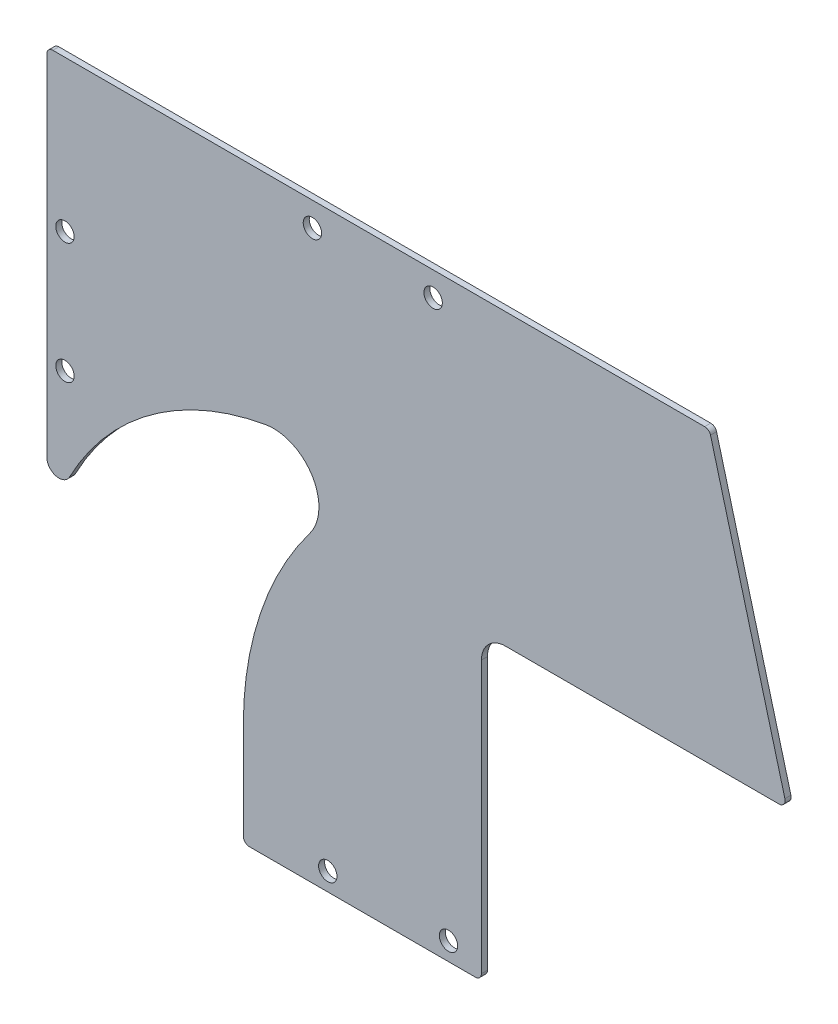
ISO-10303-21;
HEADER;
FILE_DESCRIPTION(('STEP AP214'),'2;1');
FILE_NAME('part.step','',(''),(''),'','','');
FILE_SCHEMA(('AUTOMOTIVE_DESIGN { 1 0 10303 214 1 1 1 1 }'));
ENDSEC;
DATA;
#1=APPLICATION_CONTEXT('core data for automotive mechanical design processes');
#2=APPLICATION_PROTOCOL_DEFINITION('international standard','automotive_design',2000,#1);
#3=PRODUCT_CONTEXT('',#1,'mechanical');
#4=PRODUCT('Part','Part','',(#3));
#5=PRODUCT_RELATED_PRODUCT_CATEGORY('part','',(#4));
#6=PRODUCT_DEFINITION_FORMATION('','',#4);
#7=PRODUCT_DEFINITION_CONTEXT('part definition',#1,'design');
#8=PRODUCT_DEFINITION('design','',#6,#7);
#9=PRODUCT_DEFINITION_SHAPE('','',#8);
#10=(LENGTH_UNIT() NAMED_UNIT(*) SI_UNIT(.MILLI.,.METRE.));
#11=(NAMED_UNIT(*) PLANE_ANGLE_UNIT() SI_UNIT($,.RADIAN.));
#12=(NAMED_UNIT(*) SI_UNIT($,.STERADIAN.) SOLID_ANGLE_UNIT());
#13=UNCERTAINTY_MEASURE_WITH_UNIT(LENGTH_MEASURE(1.E-05),#10,'distance_accuracy_value','');
#14=(GEOMETRIC_REPRESENTATION_CONTEXT(3) GLOBAL_UNCERTAINTY_ASSIGNED_CONTEXT((#13)) GLOBAL_UNIT_ASSIGNED_CONTEXT((#10,
#11,#12)) REPRESENTATION_CONTEXT('',''));
#15=CARTESIAN_POINT('',(0.,0.,0.));
#16=DIRECTION('',(0.,0.,1.));
#17=DIRECTION('',(1.,0.,0.));
#18=AXIS2_PLACEMENT_3D('',#15,#16,#17);
#19=CARTESIAN_POINT('',(-70.,51.5,0.5));
#20=DIRECTION('',(0.,-1.,0.));
#21=DIRECTION('',(0.,0.,-1.));
#22=AXIS2_PLACEMENT_3D('',#19,#20,#21);
#23=PLANE('',#22);
#24=DIRECTION('',(-1.,0.,0.));
#25=VECTOR('',#24,1.);
#26=CARTESIAN_POINT('',(-70.,51.5,0.5));
#27=LINE('',#26,#25);
#28=CARTESIAN_POINT('',(38.9977152093343,51.5,0.5));
#29=VERTEX_POINT('',#28);
#30=CARTESIAN_POINT('',(-69.,51.5,0.5));
#31=VERTEX_POINT('',#30);
#32=EDGE_CURVE('E186',#29,#31,#27,.T.);
#33=ORIENTED_EDGE('',*,*,#32,.F.);
#34=DIRECTION('',(0.,0.,1.));
#35=VECTOR('',#34,1.);
#36=CARTESIAN_POINT('',(38.9977152093343,51.5,0.5));
#37=LINE('',#36,#35);
#38=CARTESIAN_POINT('',(38.9977152093343,51.5,-0.5));
#39=VERTEX_POINT('',#38);
#40=EDGE_CURVE('E258',#29,#39,#37,.F.);
#41=ORIENTED_EDGE('',*,*,#40,.T.);
#42=DIRECTION('',(-1.,0.,0.));
#43=VECTOR('',#42,1.);
#44=CARTESIAN_POINT('',(-70.,51.5,-0.5));
#45=LINE('',#44,#43);
#46=CARTESIAN_POINT('',(-69.,51.5,-0.5));
#47=VERTEX_POINT('',#46);
#48=EDGE_CURVE('E337',#39,#47,#45,.T.);
#49=ORIENTED_EDGE('',*,*,#48,.T.);
#50=DIRECTION('',(0.,0.,-1.));
#51=VECTOR('',#50,1.);
#52=CARTESIAN_POINT('',(-69.,51.5,0.5));
#53=LINE('',#52,#51);
#54=EDGE_CURVE('E59',#47,#31,#53,.F.);
#55=ORIENTED_EDGE('',*,*,#54,.T.);
#56=EDGE_LOOP('',(#33,#41,#49,#55));
#57=FACE_BOUND('',#56,.T.);
#58=ADVANCED_FACE('F36',(#57),#23,.F.);
#59=CARTESIAN_POINT('',(-70.,-51.5,0.5));
#60=DIRECTION('',(1.,0.,0.));
#61=DIRECTION('',(0.,0.,-1.));
#62=AXIS2_PLACEMENT_3D('',#59,#60,#61);
#63=PLANE('',#62);
#64=DIRECTION('',(0.,-1.,0.));
#65=VECTOR('',#64,1.);
#66=CARTESIAN_POINT('',(-70.,-51.5,0.5));
#67=LINE('',#66,#65);
#68=CARTESIAN_POINT('',(-70.,50.5,0.5));
#69=VERTEX_POINT('',#68);
#70=CARTESIAN_POINT('',(-70.,-7.39181994361445,0.5));
#71=VERTEX_POINT('',#70);
#72=EDGE_CURVE('E184',#69,#71,#67,.T.);
#73=ORIENTED_EDGE('',*,*,#72,.F.);
#74=DIRECTION('',(0.,0.,-1.));
#75=VECTOR('',#74,1.);
#76=CARTESIAN_POINT('',(-70.,50.5,0.5));
#77=LINE('',#76,#75);
#78=CARTESIAN_POINT('',(-70.,50.5,-0.5));
#79=VERTEX_POINT('',#78);
#80=EDGE_CURVE('E260',#69,#79,#77,.T.);
#81=ORIENTED_EDGE('',*,*,#80,.T.);
#82=DIRECTION('',(0.,-1.,0.));
#83=VECTOR('',#82,1.);
#84=CARTESIAN_POINT('',(-70.,-51.5,-0.5));
#85=LINE('',#84,#83);
#86=CARTESIAN_POINT('',(-70.,-7.39181994361445,-0.5));
#87=VERTEX_POINT('',#86);
#88=EDGE_CURVE('E189',#79,#87,#85,.T.);
#89=ORIENTED_EDGE('',*,*,#88,.T.);
#90=DIRECTION('',(0.,0.,1.));
#91=VECTOR('',#90,1.);
#92=CARTESIAN_POINT('',(-70.,-7.39181994361445,0.5));
#93=LINE('',#92,#91);
#94=EDGE_CURVE('E206',#87,#71,#93,.T.);
#95=ORIENTED_EDGE('',*,*,#94,.T.);
#96=EDGE_LOOP('',(#73,#81,#89,#95));
#97=FACE_BOUND('',#96,.T.);
#98=ADVANCED_FACE('F341',(#97),#63,.F.);
#99=CARTESIAN_POINT('',(0.,0.,0.5));
#100=DIRECTION('',(0.,0.,-1.));
#101=DIRECTION('',(-1.,0.,0.));
#102=AXIS2_PLACEMENT_3D('',#99,#100,#101);
#103=PLANE('',#102);
#104=CARTESIAN_POINT('',(-3.45000000000001,-43.4999999999971,0.5));
#105=DIRECTION('',(0.,0.,1.));
#106=DIRECTION('',(1.,0.,0.));
#107=AXIS2_PLACEMENT_3D('',#104,#105,#106);
#108=CIRCLE('',#107,1.525);
#109=CARTESIAN_POINT('',(-1.92500000000001,-43.4999999999971,0.5));
#110=VERTEX_POINT('',#109);
#111=EDGE_CURVE('E286',#110,#110,#108,.T.);
#112=ORIENTED_EDGE('',*,*,#111,.F.);
#113=EDGE_LOOP('',(#112));
#114=FACE_BOUND('',#113,.T.);
#115=CARTESIAN_POINT('',(-23.45,-43.4999999999971,0.5));
#116=DIRECTION('',(0.,0.,1.));
#117=DIRECTION('',(1.,0.,0.));
#118=AXIS2_PLACEMENT_3D('',#115,#116,#117);
#119=CIRCLE('',#118,1.525);
#120=CARTESIAN_POINT('',(-21.925,-43.4999999999971,0.5));
#121=VERTEX_POINT('',#120);
#122=EDGE_CURVE('E289',#121,#121,#119,.T.);
#123=ORIENTED_EDGE('',*,*,#122,.F.);
#124=EDGE_LOOP('',(#123));
#125=FACE_BOUND('',#124,.T.);
#126=CARTESIAN_POINT('',(-67.,6.50000000000004,0.5));
#127=DIRECTION('',(0.,0.,-1.));
#128=DIRECTION('',(-1.,0.,0.));
#129=AXIS2_PLACEMENT_3D('',#126,#127,#128);
#130=CIRCLE('',#129,1.525);
#131=CARTESIAN_POINT('',(-68.525,6.50000000000004,0.5));
#132=VERTEX_POINT('',#131);
#133=EDGE_CURVE('E303',#132,#132,#130,.T.);
#134=ORIENTED_EDGE('',*,*,#133,.T.);
#135=EDGE_LOOP('',(#134));
#136=FACE_BOUND('',#135,.T.);
#137=CARTESIAN_POINT('',(-67.,26.5,0.5));
#138=DIRECTION('',(0.,0.,-1.));
#139=DIRECTION('',(-1.,0.,0.));
#140=AXIS2_PLACEMENT_3D('',#137,#138,#139);
#141=CIRCLE('',#140,1.525);
#142=CARTESIAN_POINT('',(-68.525,26.5,0.5));
#143=VERTEX_POINT('',#142);
#144=EDGE_CURVE('E298',#143,#143,#141,.T.);
#145=ORIENTED_EDGE('',*,*,#144,.T.);
#146=EDGE_LOOP('',(#145));
#147=FACE_BOUND('',#146,.T.);
#148=CARTESIAN_POINT('',(-26.,47.4999999999999,0.5));
#149=DIRECTION('',(0.,0.,1.));
#150=DIRECTION('',(1.,0.,0.));
#151=AXIS2_PLACEMENT_3D('',#148,#149,#150);
#152=CIRCLE('',#151,1.525);
#153=CARTESIAN_POINT('',(-24.475,47.4999999999999,0.5));
#154=VERTEX_POINT('',#153);
#155=EDGE_CURVE('E221',#154,#154,#152,.T.);
#156=ORIENTED_EDGE('',*,*,#155,.F.);
#157=EDGE_LOOP('',(#156));
#158=FACE_BOUND('',#157,.T.);
#159=CARTESIAN_POINT('',(-5.99999999999999,47.4999999999999,0.5));
#160=DIRECTION('',(0.,0.,1.));
#161=DIRECTION('',(1.,0.,0.));
#162=AXIS2_PLACEMENT_3D('',#159,#160,#161);
#163=CIRCLE('',#162,1.525);
#164=CARTESIAN_POINT('',(-4.47499999999999,47.4999999999999,0.5));
#165=VERTEX_POINT('',#164);
#166=EDGE_CURVE('E306',#165,#165,#163,.T.);
#167=ORIENTED_EDGE('',*,*,#166,.F.);
#168=EDGE_LOOP('',(#167));
#169=FACE_BOUND('',#168,.T.);
#170=DIRECTION('',(1.,0.,0.));
#171=VECTOR('',#170,1.);
#172=CARTESIAN_POINT('',(0.,3.50000000000301,0.5));
#173=LINE('',#172,#171);
#174=CARTESIAN_POINT('',(5.99999999999893,3.50000000000301,0.5));
#175=VERTEX_POINT('',#174);
#176=CARTESIAN_POINT('',(51.3233780611637,3.50000000000302,0.5));
#177=VERTEX_POINT('',#176);
#178=EDGE_CURVE('E177',#175,#177,#173,.T.);
#179=ORIENTED_EDGE('',*,*,#178,.T.);
#180=CARTESIAN_POINT('',(51.3233780611637,4.50000000000302,0.5));
#181=DIRECTION('',(0.,0.,-1.));
#182=DIRECTION('',(-1.,0.,0.));
#183=AXIS2_PLACEMENT_3D('',#180,#181,#182);
#184=CIRCLE('',#183,1.);
#185=CARTESIAN_POINT('',(52.2893038874528,4.75881904510552,0.5));
#186=VERTEX_POINT('',#185);
#187=EDGE_CURVE('E255',#177,#186,#184,.F.);
#188=ORIENTED_EDGE('',*,*,#187,.T.);
#189=DIRECTION('',(-0.258819045102494,0.965925826289076,0.));
#190=VECTOR('',#189,1.);
#191=CARTESIAN_POINT('',(49.9762894613727,13.3911064018773,0.5));
#192=LINE('',#191,#190);
#193=CARTESIAN_POINT('',(39.9636410356234,50.7588190451025,0.5));
#194=VERTEX_POINT('',#193);
#195=EDGE_CURVE('E178',#186,#194,#192,.T.);
#196=ORIENTED_EDGE('',*,*,#195,.T.);
#197=CARTESIAN_POINT('',(38.9977152093343,50.5,0.5));
#198=DIRECTION('',(0.,0.,-1.));
#199=DIRECTION('',(-1.,0.,0.));
#200=AXIS2_PLACEMENT_3D('',#197,#198,#199);
#201=CIRCLE('',#200,1.);
#202=EDGE_CURVE('E253',#194,#29,#201,.F.);
#203=ORIENTED_EDGE('',*,*,#202,.T.);
#204=ORIENTED_EDGE('',*,*,#32,.T.);
#205=CARTESIAN_POINT('',(-69.,50.5,0.5));
#206=DIRECTION('',(0.,0.,-1.));
#207=DIRECTION('',(-1.,0.,0.));
#208=AXIS2_PLACEMENT_3D('',#205,#206,#207);
#209=CIRCLE('',#208,1.);
#210=EDGE_CURVE('E51',#31,#69,#209,.F.);
#211=ORIENTED_EDGE('',*,*,#210,.T.);
#212=ORIENTED_EDGE('',*,*,#72,.T.);
#213=CARTESIAN_POINT('',(-68.,-7.39181994361445,0.5));
#214=DIRECTION('',(0.,0.,-1.));
#215=DIRECTION('',(-1.,0.,0.));
#216=AXIS2_PLACEMENT_3D('',#213,#214,#215);
#217=CIRCLE('',#216,2.);
#218=CARTESIAN_POINT('',(-66.2287922778268,-8.32070271604262,0.5));
#219=VERTEX_POINT('',#218);
#220=EDGE_CURVE('E209',#71,#219,#217,.F.);
#221=ORIENTED_EDGE('',*,*,#220,.T.);
#222=CARTESIAN_POINT('',(-25.8437878262082,-29.499999999997,0.5));
#223=DIRECTION('',(0.,0.,-1.));
#224=DIRECTION('',(-1.,0.,0.));
#225=AXIS2_PLACEMENT_3D('',#222,#223,#224);
#226=CIRCLE('',#225,45.6016580619539);
#227=CARTESIAN_POINT('',(-33.7501159785722,15.4110364292205,0.5));
#228=VERTEX_POINT('',#227);
#229=EDGE_CURVE('E335',#219,#228,#226,.T.);
#230=ORIENTED_EDGE('',*,*,#229,.T.);
#231=CARTESIAN_POINT('',(-32.4454458881621,8.00000000000298,0.5));
#232=DIRECTION('',(0.,0.,-1.));
#233=DIRECTION('',(-1.,0.,0.));
#234=AXIS2_PLACEMENT_3D('',#231,#232,#233);
#235=CIRCLE('',#234,7.52500000000001);
#236=CARTESIAN_POINT('',(-26.4308671354947,3.47778069661205,0.5));
#237=VERTEX_POINT('',#236);
#238=EDGE_CURVE('E332',#228,#237,#235,.T.);
#239=ORIENTED_EDGE('',*,*,#238,.T.);
#240=CARTESIAN_POINT('',(17.4297786627361,-29.499999999997,0.5));
#241=DIRECTION('',(0.,0.,-1.));
#242=DIRECTION('',(-1.,0.,0.));
#243=AXIS2_PLACEMENT_3D('',#240,#241,#242);
#244=CIRCLE('',#243,54.8752245508982);
#245=CARTESIAN_POINT('',(-37.4454458881621,-29.499999999997,0.5));
#246=VERTEX_POINT('',#245);
#247=EDGE_CURVE('E329',#237,#246,#244,.F.);
#248=ORIENTED_EDGE('',*,*,#247,.T.);
#249=DIRECTION('',(0.,-1.,0.));
#250=VECTOR('',#249,1.);
#251=CARTESIAN_POINT('',(-37.4454458881621,0.,0.5));
#252=LINE('',#251,#250);
#253=CARTESIAN_POINT('',(-37.4454458881621,-45.4999999999971,0.5));
#254=VERTEX_POINT('',#253);
#255=EDGE_CURVE('E327',#246,#254,#252,.T.);
#256=ORIENTED_EDGE('',*,*,#255,.T.);
#257=CARTESIAN_POINT('',(-36.4454458881621,-45.4999999999971,0.5));
#258=DIRECTION('',(0.,0.,-1.));
#259=DIRECTION('',(-1.,0.,0.));
#260=AXIS2_PLACEMENT_3D('',#257,#258,#259);
#261=CIRCLE('',#260,1.);
#262=CARTESIAN_POINT('',(-36.4454458881621,-46.4999999999971,0.5));
#263=VERTEX_POINT('',#262);
#264=EDGE_CURVE('E248',#254,#263,#261,.F.);
#265=ORIENTED_EDGE('',*,*,#264,.T.);
#266=DIRECTION('',(-1.,0.,0.));
#267=VECTOR('',#266,1.);
#268=CARTESIAN_POINT('',(-37.4454458881621,-46.4999999999971,0.5));
#269=LINE('',#268,#267);
#270=CARTESIAN_POINT('',(0.999999999998932,-46.4999999999971,0.5));
#271=VERTEX_POINT('',#270);
#272=EDGE_CURVE('E282',#271,#263,#269,.T.);
#273=ORIENTED_EDGE('',*,*,#272,.F.);
#274=CARTESIAN_POINT('',(0.999999999998932,-45.4999999999971,0.5));
#275=DIRECTION('',(0.,0.,-1.));
#276=DIRECTION('',(-1.,0.,0.));
#277=AXIS2_PLACEMENT_3D('',#274,#275,#276);
#278=CIRCLE('',#277,1.);
#279=CARTESIAN_POINT('',(1.99999999999893,-45.4999999999971,0.5));
#280=VERTEX_POINT('',#279);
#281=EDGE_CURVE('E250',#271,#280,#278,.F.);
#282=ORIENTED_EDGE('',*,*,#281,.T.);
#283=DIRECTION('',(0.,1.,0.));
#284=VECTOR('',#283,1.);
#285=CARTESIAN_POINT('',(1.99999999999893,0.,0.5));
#286=LINE('',#285,#284);
#287=CARTESIAN_POINT('',(1.99999999999893,-0.499999999996981,0.5));
#288=VERTEX_POINT('',#287);
#289=EDGE_CURVE('E271',#280,#288,#286,.T.);
#290=ORIENTED_EDGE('',*,*,#289,.T.);
#291=CARTESIAN_POINT('',(5.99999999999893,-0.499999999996982,0.5));
#292=DIRECTION('',(0.,0.,-1.));
#293=DIRECTION('',(-1.,0.,0.));
#294=AXIS2_PLACEMENT_3D('',#291,#292,#293);
#295=CIRCLE('',#294,4.);
#296=EDGE_CURVE('E324',#288,#175,#295,.T.);
#297=ORIENTED_EDGE('',*,*,#296,.T.);
#298=EDGE_LOOP('',(#179,#188,#196,#203,#204,#211,#212,#221,#230,#239,#248,#256,#265,#273,#282,
#290,#297));
#299=FACE_BOUND('',#298,.T.);
#300=ADVANCED_FACE('F284',(#114,#125,#136,#147,#158,#169,#299),#103,.F.);
#301=CARTESIAN_POINT('',(0.,0.,-0.5));
#302=DIRECTION('',(0.,0.,-1.));
#303=DIRECTION('',(-1.,0.,0.));
#304=AXIS2_PLACEMENT_3D('',#301,#302,#303);
#305=PLANE('',#304);
#306=DIRECTION('',(-0.258819045102494,0.965925826289076,0.));
#307=VECTOR('',#306,1.);
#308=CARTESIAN_POINT('',(49.9762894613727,13.3911064018773,-0.5));
#309=LINE('',#308,#307);
#310=CARTESIAN_POINT('',(52.2893038874528,4.75881904510552,-0.5));
#311=VERTEX_POINT('',#310);
#312=CARTESIAN_POINT('',(39.9636410356234,50.7588190451025,-0.5));
#313=VERTEX_POINT('',#312);
#314=EDGE_CURVE('E203',#311,#313,#309,.T.);
#315=ORIENTED_EDGE('',*,*,#314,.F.);
#316=CARTESIAN_POINT('',(51.3233780611637,4.50000000000302,-0.5));
#317=DIRECTION('',(0.,0.,-1.));
#318=DIRECTION('',(-1.,0.,0.));
#319=AXIS2_PLACEMENT_3D('',#316,#317,#318);
#320=CIRCLE('',#319,1.);
#321=CARTESIAN_POINT('',(51.3233780611637,3.50000000000302,-0.5));
#322=VERTEX_POINT('',#321);
#323=EDGE_CURVE('E183',#311,#322,#320,.T.);
#324=ORIENTED_EDGE('',*,*,#323,.T.);
#325=DIRECTION('',(1.,0.,0.));
#326=VECTOR('',#325,1.);
#327=CARTESIAN_POINT('',(0.,3.50000000000301,-0.5));
#328=LINE('',#327,#326);
#329=CARTESIAN_POINT('',(5.99999999999893,3.50000000000301,-0.5));
#330=VERTEX_POINT('',#329);
#331=EDGE_CURVE('E170',#330,#322,#328,.T.);
#332=ORIENTED_EDGE('',*,*,#331,.F.);
#333=CARTESIAN_POINT('',(5.99999999999893,-0.499999999996982,-0.5));
#334=DIRECTION('',(0.,0.,-1.));
#335=DIRECTION('',(-1.,0.,0.));
#336=AXIS2_PLACEMENT_3D('',#333,#334,#335);
#337=CIRCLE('',#336,4.);
#338=CARTESIAN_POINT('',(1.99999999999893,-0.499999999996981,-0.5));
#339=VERTEX_POINT('',#338);
#340=EDGE_CURVE('E158',#339,#330,#337,.T.);
#341=ORIENTED_EDGE('',*,*,#340,.F.);
#342=DIRECTION('',(0.,1.,0.));
#343=VECTOR('',#342,1.);
#344=CARTESIAN_POINT('',(1.99999999999893,0.,-0.5));
#345=LINE('',#344,#343);
#346=CARTESIAN_POINT('',(1.99999999999893,-45.4999999999971,-0.5));
#347=VERTEX_POINT('',#346);
#348=EDGE_CURVE('E169',#347,#339,#345,.T.);
#349=ORIENTED_EDGE('',*,*,#348,.F.);
#350=CARTESIAN_POINT('',(0.999999999998932,-45.4999999999971,-0.5));
#351=DIRECTION('',(0.,0.,-1.));
#352=DIRECTION('',(-1.,0.,0.));
#353=AXIS2_PLACEMENT_3D('',#350,#351,#352);
#354=CIRCLE('',#353,1.);
#355=CARTESIAN_POINT('',(0.999999999998932,-46.4999999999971,-0.5));
#356=VERTEX_POINT('',#355);
#357=EDGE_CURVE('E239',#347,#356,#354,.T.);
#358=ORIENTED_EDGE('',*,*,#357,.T.);
#359=DIRECTION('',(1.,0.,0.));
#360=VECTOR('',#359,1.);
#361=CARTESIAN_POINT('',(0.,-46.4999999999971,-0.5));
#362=LINE('',#361,#360);
#363=CARTESIAN_POINT('',(-36.4454458881621,-46.4999999999971,-0.5));
#364=VERTEX_POINT('',#363);
#365=EDGE_CURVE('E228',#364,#356,#362,.T.);
#366=ORIENTED_EDGE('',*,*,#365,.F.);
#367=CARTESIAN_POINT('',(-36.4454458881621,-45.4999999999971,-0.5));
#368=DIRECTION('',(0.,0.,-1.));
#369=DIRECTION('',(-1.,0.,0.));
#370=AXIS2_PLACEMENT_3D('',#367,#368,#369);
#371=CIRCLE('',#370,1.);
#372=CARTESIAN_POINT('',(-37.4454458881621,-45.4999999999971,-0.5));
#373=VERTEX_POINT('',#372);
#374=EDGE_CURVE('E237',#364,#373,#371,.T.);
#375=ORIENTED_EDGE('',*,*,#374,.T.);
#376=DIRECTION('',(0.,-1.,0.));
#377=VECTOR('',#376,1.);
#378=CARTESIAN_POINT('',(-37.4454458881621,0.,-0.5));
#379=LINE('',#378,#377);
#380=CARTESIAN_POINT('',(-37.4454458881621,-29.499999999997,-0.5));
#381=VERTEX_POINT('',#380);
#382=EDGE_CURVE('E193',#381,#373,#379,.T.);
#383=ORIENTED_EDGE('',*,*,#382,.F.);
#384=CARTESIAN_POINT('',(17.4297786627361,-29.499999999997,-0.5));
#385=DIRECTION('',(0.,0.,-1.));
#386=DIRECTION('',(-1.,0.,0.));
#387=AXIS2_PLACEMENT_3D('',#384,#385,#386);
#388=CIRCLE('',#387,54.8752245508982);
#389=CARTESIAN_POINT('',(-26.4308671354947,3.47778069661205,-0.5));
#390=VERTEX_POINT('',#389);
#391=EDGE_CURVE('E196',#390,#381,#388,.F.);
#392=ORIENTED_EDGE('',*,*,#391,.F.);
#393=CARTESIAN_POINT('',(-32.4454458881621,8.00000000000298,-0.5));
#394=DIRECTION('',(0.,0.,-1.));
#395=DIRECTION('',(-1.,0.,0.));
#396=AXIS2_PLACEMENT_3D('',#393,#394,#395);
#397=CIRCLE('',#396,7.52500000000001);
#398=CARTESIAN_POINT('',(-33.7501159785722,15.4110364292205,-0.5));
#399=VERTEX_POINT('',#398);
#400=EDGE_CURVE('E199',#399,#390,#397,.T.);
#401=ORIENTED_EDGE('',*,*,#400,.F.);
#402=CARTESIAN_POINT('',(-25.8437878262082,-29.499999999997,-0.5));
#403=DIRECTION('',(0.,0.,-1.));
#404=DIRECTION('',(-1.,0.,0.));
#405=AXIS2_PLACEMENT_3D('',#402,#403,#404);
#406=CIRCLE('',#405,45.6016580619539);
#407=CARTESIAN_POINT('',(-66.2287922778268,-8.32070271604262,-0.5));
#408=VERTEX_POINT('',#407);
#409=EDGE_CURVE('E201',#408,#399,#406,.T.);
#410=ORIENTED_EDGE('',*,*,#409,.F.);
#411=CARTESIAN_POINT('',(-68.,-7.39181994361445,-0.5));
#412=DIRECTION('',(0.,0.,-1.));
#413=DIRECTION('',(-1.,0.,0.));
#414=AXIS2_PLACEMENT_3D('',#411,#412,#413);
#415=CIRCLE('',#414,2.);
#416=EDGE_CURVE('E213',#408,#87,#415,.T.);
#417=ORIENTED_EDGE('',*,*,#416,.T.);
#418=ORIENTED_EDGE('',*,*,#88,.F.);
#419=CARTESIAN_POINT('',(-69.,50.5,-0.5));
#420=DIRECTION('',(0.,0.,-1.));
#421=DIRECTION('',(-1.,0.,0.));
#422=AXIS2_PLACEMENT_3D('',#419,#420,#421);
#423=CIRCLE('',#422,1.);
#424=EDGE_CURVE('E241',#79,#47,#423,.T.);
#425=ORIENTED_EDGE('',*,*,#424,.T.);
#426=ORIENTED_EDGE('',*,*,#48,.F.);
#427=CARTESIAN_POINT('',(38.9977152093343,50.5,-0.5));
#428=DIRECTION('',(0.,0.,-1.));
#429=DIRECTION('',(-1.,0.,0.));
#430=AXIS2_PLACEMENT_3D('',#427,#428,#429);
#431=CIRCLE('',#430,1.);
#432=EDGE_CURVE('E243',#39,#313,#431,.T.);
#433=ORIENTED_EDGE('',*,*,#432,.T.);
#434=EDGE_LOOP('',(#315,#324,#332,#341,#349,#358,#366,#375,#383,#392,#401,#410,#417,#418,#425,
#426,#433));
#435=FACE_BOUND('',#434,.T.);
#436=CARTESIAN_POINT('',(-3.45000000000001,-43.4999999999971,-0.5));
#437=DIRECTION('',(0.,0.,-1.));
#438=DIRECTION('',(-1.,0.,0.));
#439=AXIS2_PLACEMENT_3D('',#436,#437,#438);
#440=CIRCLE('',#439,1.525);
#441=CARTESIAN_POINT('',(-4.97500000000001,-43.4999999999971,-0.5));
#442=VERTEX_POINT('',#441);
#443=EDGE_CURVE('E227',#442,#442,#440,.T.);
#444=ORIENTED_EDGE('',*,*,#443,.F.);
#445=EDGE_LOOP('',(#444));
#446=FACE_BOUND('',#445,.T.);
#447=CARTESIAN_POINT('',(-23.45,-43.4999999999971,-0.5));
#448=DIRECTION('',(0.,0.,-1.));
#449=DIRECTION('',(-1.,0.,0.));
#450=AXIS2_PLACEMENT_3D('',#447,#448,#449);
#451=CIRCLE('',#450,1.525);
#452=CARTESIAN_POINT('',(-24.975,-43.4999999999971,-0.5));
#453=VERTEX_POINT('',#452);
#454=EDGE_CURVE('E224',#453,#453,#451,.T.);
#455=ORIENTED_EDGE('',*,*,#454,.F.);
#456=EDGE_LOOP('',(#455));
#457=FACE_BOUND('',#456,.T.);
#458=CARTESIAN_POINT('',(-67.,6.50000000000004,-0.5));
#459=DIRECTION('',(0.,0.,-1.));
#460=DIRECTION('',(-1.,0.,0.));
#461=AXIS2_PLACEMENT_3D('',#458,#459,#460);
#462=CIRCLE('',#461,1.525);
#463=CARTESIAN_POINT('',(-68.525,6.50000000000004,-0.5));
#464=VERTEX_POINT('',#463);
#465=EDGE_CURVE('E295',#464,#464,#462,.T.);
#466=ORIENTED_EDGE('',*,*,#465,.F.);
#467=EDGE_LOOP('',(#466));
#468=FACE_BOUND('',#467,.T.);
#469=CARTESIAN_POINT('',(-67.,26.5,-0.5));
#470=DIRECTION('',(0.,0.,-1.));
#471=DIRECTION('',(-1.,0.,0.));
#472=AXIS2_PLACEMENT_3D('',#469,#470,#471);
#473=CIRCLE('',#472,1.525);
#474=CARTESIAN_POINT('',(-68.525,26.5,-0.5));
#475=VERTEX_POINT('',#474);
#476=EDGE_CURVE('E231',#475,#475,#473,.T.);
#477=ORIENTED_EDGE('',*,*,#476,.F.);
#478=EDGE_LOOP('',(#477));
#479=FACE_BOUND('',#478,.T.);
#480=CARTESIAN_POINT('',(-26.,47.4999999999999,-0.5));
#481=DIRECTION('',(0.,0.,-1.));
#482=DIRECTION('',(-1.,0.,0.));
#483=AXIS2_PLACEMENT_3D('',#480,#481,#482);
#484=CIRCLE('',#483,1.525);
#485=CARTESIAN_POINT('',(-27.525,47.4999999999999,-0.5));
#486=VERTEX_POINT('',#485);
#487=EDGE_CURVE('E220',#486,#486,#484,.T.);
#488=ORIENTED_EDGE('',*,*,#487,.F.);
#489=EDGE_LOOP('',(#488));
#490=FACE_BOUND('',#489,.T.);
#491=CARTESIAN_POINT('',(-5.99999999999999,47.4999999999999,-0.5));
#492=DIRECTION('',(0.,0.,-1.));
#493=DIRECTION('',(-1.,0.,0.));
#494=AXIS2_PLACEMENT_3D('',#491,#492,#493);
#495=CIRCLE('',#494,1.525);
#496=CARTESIAN_POINT('',(-7.52499999999999,47.4999999999999,-0.5));
#497=VERTEX_POINT('',#496);
#498=EDGE_CURVE('E217',#497,#497,#495,.T.);
#499=ORIENTED_EDGE('',*,*,#498,.F.);
#500=EDGE_LOOP('',(#499));
#501=FACE_BOUND('',#500,.T.);
#502=ADVANCED_FACE('F181',(#435,#446,#457,#468,#479,#490,#501),#305,.T.);
#503=CARTESIAN_POINT('',(1.99999999999893,-0.499999999996982,-1.));
#504=DIRECTION('',(-1.,0.,0.));
#505=DIRECTION('',(0.,-1.,0.));
#506=AXIS2_PLACEMENT_3D('',#503,#504,#505);
#507=PLANE('',#506);
#508=ORIENTED_EDGE('',*,*,#289,.F.);
#509=DIRECTION('',(0.,0.,1.));
#510=VECTOR('',#509,1.);
#511=CARTESIAN_POINT('',(1.99999999999893,-45.4999999999971,-1.));
#512=LINE('',#511,#510);
#513=EDGE_CURVE('E44',#280,#347,#512,.F.);
#514=ORIENTED_EDGE('',*,*,#513,.T.);
#515=ORIENTED_EDGE('',*,*,#348,.T.);
#516=DIRECTION('',(0.,0.,1.));
#517=VECTOR('',#516,1.);
#518=CARTESIAN_POINT('',(1.99999999999893,-0.499999999996981,-1.));
#519=LINE('',#518,#517);
#520=EDGE_CURVE('E165',#339,#288,#519,.T.);
#521=ORIENTED_EDGE('',*,*,#520,.T.);
#522=EDGE_LOOP('',(#508,#514,#515,#521));
#523=FACE_BOUND('',#522,.T.);
#524=ADVANCED_FACE('F270',(#523),#507,.F.);
#525=CARTESIAN_POINT('',(5.99999999999893,-0.499999999996982,-1.));
#526=DIRECTION('',(0.,0.,1.));
#527=DIRECTION('',(1.,0.,0.));
#528=AXIS2_PLACEMENT_3D('',#525,#526,#527);
#529=CYLINDRICAL_SURFACE('',#528,4.);
#530=ORIENTED_EDGE('',*,*,#520,.F.);
#531=ORIENTED_EDGE('',*,*,#340,.T.);
#532=DIRECTION('',(0.,0.,1.));
#533=VECTOR('',#532,1.);
#534=CARTESIAN_POINT('',(5.99999999999893,3.50000000000301,-1.));
#535=LINE('',#534,#533);
#536=EDGE_CURVE('E162',#330,#175,#535,.T.);
#537=ORIENTED_EDGE('',*,*,#536,.T.);
#538=ORIENTED_EDGE('',*,*,#296,.F.);
#539=EDGE_LOOP('',(#530,#531,#537,#538));
#540=FACE_BOUND('',#539,.T.);
#541=ADVANCED_FACE('F160',(#540),#529,.F.);
#542=CARTESIAN_POINT('',(33.9999999999989,3.50000000000302,-1.));
#543=DIRECTION('',(0.,1.,0.));
#544=DIRECTION('',(-1.,0.,0.));
#545=AXIS2_PLACEMENT_3D('',#542,#543,#544);
#546=PLANE('',#545);
#547=ORIENTED_EDGE('',*,*,#331,.T.);
#548=DIRECTION('',(0.,0.,-1.));
#549=VECTOR('',#548,1.);
#550=CARTESIAN_POINT('',(51.3233780611637,3.50000000000302,-1.));
#551=LINE('',#550,#549);
#552=EDGE_CURVE('E246',#322,#177,#551,.F.);
#553=ORIENTED_EDGE('',*,*,#552,.T.);
#554=ORIENTED_EDGE('',*,*,#178,.F.);
#555=ORIENTED_EDGE('',*,*,#536,.F.);
#556=EDGE_LOOP('',(#547,#553,#554,#555));
#557=FACE_BOUND('',#556,.T.);
#558=ADVANCED_FACE('F174',(#557),#546,.F.);
#559=CARTESIAN_POINT('',(-25.8437878262082,-29.499999999997,-1.));
#560=DIRECTION('',(0.,0.,1.));
#561=DIRECTION('',(1.,0.,0.));
#562=AXIS2_PLACEMENT_3D('',#559,#560,#561);
#563=CYLINDRICAL_SURFACE('',#562,45.6016580619539);
#564=ORIENTED_EDGE('',*,*,#229,.F.);
#565=DIRECTION('',(0.,0.,1.));
#566=VECTOR('',#565,1.);
#567=CARTESIAN_POINT('',(-66.2287922778268,-8.32070271604262,-1.));
#568=LINE('',#567,#566);
#569=EDGE_CURVE('E211',#219,#408,#568,.F.);
#570=ORIENTED_EDGE('',*,*,#569,.T.);
#571=ORIENTED_EDGE('',*,*,#409,.T.);
#572=DIRECTION('',(0.,0.,1.));
#573=VECTOR('',#572,1.);
#574=CARTESIAN_POINT('',(-33.7501159785722,15.4110364292205,-1.));
#575=LINE('',#574,#573);
#576=EDGE_CURVE('E313',#399,#228,#575,.T.);
#577=ORIENTED_EDGE('',*,*,#576,.T.);
#578=EDGE_LOOP('',(#564,#570,#571,#577));
#579=FACE_BOUND('',#578,.T.);
#580=ADVANCED_FACE('F354',(#579),#563,.F.);
#581=CARTESIAN_POINT('',(-32.4454458881621,8.00000000000298,-1.));
#582=DIRECTION('',(0.,0.,1.));
#583=DIRECTION('',(1.,0.,0.));
#584=AXIS2_PLACEMENT_3D('',#581,#582,#583);
#585=CYLINDRICAL_SURFACE('',#584,7.52500000000001);
#586=ORIENTED_EDGE('',*,*,#576,.F.);
#587=ORIENTED_EDGE('',*,*,#400,.T.);
#588=DIRECTION('',(0.,0.,1.));
#589=VECTOR('',#588,1.);
#590=CARTESIAN_POINT('',(-26.4308671354947,3.47778069661205,-1.));
#591=LINE('',#590,#589);
#592=EDGE_CURVE('E316',#390,#237,#591,.T.);
#593=ORIENTED_EDGE('',*,*,#592,.T.);
#594=ORIENTED_EDGE('',*,*,#238,.F.);
#595=EDGE_LOOP('',(#586,#587,#593,#594));
#596=FACE_BOUND('',#595,.T.);
#597=ADVANCED_FACE('F357',(#596),#585,.F.);
#598=CARTESIAN_POINT('',(17.4297786627361,-29.499999999997,-1.));
#599=DIRECTION('',(0.,0.,1.));
#600=DIRECTION('',(1.,0.,0.));
#601=AXIS2_PLACEMENT_3D('',#598,#599,#600);
#602=CYLINDRICAL_SURFACE('',#601,54.8752245508982);
#603=ORIENTED_EDGE('',*,*,#592,.F.);
#604=ORIENTED_EDGE('',*,*,#391,.T.);
#605=DIRECTION('',(0.,0.,1.));
#606=VECTOR('',#605,1.);
#607=CARTESIAN_POINT('',(-37.4454458881621,-29.499999999997,-1.));
#608=LINE('',#607,#606);
#609=EDGE_CURVE('E319',#381,#246,#608,.T.);
#610=ORIENTED_EDGE('',*,*,#609,.T.);
#611=ORIENTED_EDGE('',*,*,#247,.F.);
#612=EDGE_LOOP('',(#603,#604,#610,#611));
#613=FACE_BOUND('',#612,.T.);
#614=ADVANCED_FACE('F362',(#613),#602,.T.);
#615=CARTESIAN_POINT('',(-37.4454458881621,-77.499999999997,-1.));
#616=DIRECTION('',(1.,0.,0.));
#617=DIRECTION('',(0.,0.,-1.));
#618=AXIS2_PLACEMENT_3D('',#615,#616,#617);
#619=PLANE('',#618);
#620=ORIENTED_EDGE('',*,*,#382,.T.);
#621=DIRECTION('',(0.,0.,1.));
#622=VECTOR('',#621,1.);
#623=CARTESIAN_POINT('',(-37.4454458881621,-45.4999999999971,-1.));
#624=LINE('',#623,#622);
#625=EDGE_CURVE('E11',#373,#254,#624,.T.);
#626=ORIENTED_EDGE('',*,*,#625,.T.);
#627=ORIENTED_EDGE('',*,*,#255,.F.);
#628=ORIENTED_EDGE('',*,*,#609,.F.);
#629=EDGE_LOOP('',(#620,#626,#627,#628));
#630=FACE_BOUND('',#629,.T.);
#631=ADVANCED_FACE('F364',(#630),#619,.F.);
#632=CARTESIAN_POINT('',(67.3638090177158,-51.5,-1.));
#633=DIRECTION('',(-0.965925826289075,-0.258819045102494,0.));
#634=DIRECTION('',(0.258819045102494,-0.965925826289076,0.));
#635=AXIS2_PLACEMENT_3D('',#632,#633,#634);
#636=PLANE('',#635);
#637=ORIENTED_EDGE('',*,*,#195,.F.);
#638=DIRECTION('',(0.,0.,-1.));
#639=VECTOR('',#638,1.);
#640=CARTESIAN_POINT('',(52.2893038874528,4.75881904510551,-1.));
#641=LINE('',#640,#639);
#642=EDGE_CURVE('E234',#186,#311,#641,.T.);
#643=ORIENTED_EDGE('',*,*,#642,.T.);
#644=ORIENTED_EDGE('',*,*,#314,.T.);
#645=DIRECTION('',(0.,0.,1.));
#646=VECTOR('',#645,1.);
#647=CARTESIAN_POINT('',(39.9636410356234,50.7588190451025,-1.));
#648=LINE('',#647,#646);
#649=EDGE_CURVE('E216',#313,#194,#648,.T.);
#650=ORIENTED_EDGE('',*,*,#649,.T.);
#651=EDGE_LOOP('',(#637,#643,#644,#650));
#652=FACE_BOUND('',#651,.T.);
#653=ADVANCED_FACE('F384',(#652),#636,.F.);
#654=CARTESIAN_POINT('',(-68.,-7.39181994361445,-1.));
#655=DIRECTION('',(0.,0.,1.));
#656=DIRECTION('',(1.,0.,0.));
#657=AXIS2_PLACEMENT_3D('',#654,#655,#656);
#658=CYLINDRICAL_SURFACE('',#657,2.);
#659=ORIENTED_EDGE('',*,*,#416,.F.);
#660=ORIENTED_EDGE('',*,*,#569,.F.);
#661=ORIENTED_EDGE('',*,*,#220,.F.);
#662=ORIENTED_EDGE('',*,*,#94,.F.);
#663=EDGE_LOOP('',(#659,#660,#661,#662));
#664=FACE_BOUND('',#663,.T.);
#665=ADVANCED_FACE('F350',(#664),#658,.T.);
#666=CARTESIAN_POINT('',(-5.99999999999999,47.4999999999999,-9.5));
#667=DIRECTION('',(0.,0.,1.));
#668=DIRECTION('',(1.,0.,0.));
#669=AXIS2_PLACEMENT_3D('',#666,#667,#668);
#670=CYLINDRICAL_SURFACE('',#669,1.525);
#671=ORIENTED_EDGE('',*,*,#498,.T.);
#672=EDGE_LOOP('',(#671));
#673=FACE_BOUND('',#672,.T.);
#674=ORIENTED_EDGE('',*,*,#166,.T.);
#675=EDGE_LOOP('',(#674));
#676=FACE_BOUND('',#675,.T.);
#677=ADVANCED_FACE('F383',(#673,#676),#670,.F.);
#678=CARTESIAN_POINT('',(-26.,47.4999999999999,-9.5));
#679=DIRECTION('',(0.,0.,1.));
#680=DIRECTION('',(1.,0.,0.));
#681=AXIS2_PLACEMENT_3D('',#678,#679,#680);
#682=CYLINDRICAL_SURFACE('',#681,1.525);
#683=ORIENTED_EDGE('',*,*,#487,.T.);
#684=EDGE_LOOP('',(#683));
#685=FACE_BOUND('',#684,.T.);
#686=ORIENTED_EDGE('',*,*,#155,.T.);
#687=EDGE_LOOP('',(#686));
#688=FACE_BOUND('',#687,.T.);
#689=ADVANCED_FACE('F537',(#685,#688),#682,.F.);
#690=CARTESIAN_POINT('',(-67.,26.5,9.5));
#691=DIRECTION('',(0.,0.,-1.));
#692=DIRECTION('',(-1.,0.,0.));
#693=AXIS2_PLACEMENT_3D('',#690,#691,#692);
#694=CYLINDRICAL_SURFACE('',#693,1.525);
#695=ORIENTED_EDGE('',*,*,#476,.T.);
#696=EDGE_LOOP('',(#695));
#697=FACE_BOUND('',#696,.T.);
#698=ORIENTED_EDGE('',*,*,#144,.F.);
#699=EDGE_LOOP('',(#698));
#700=FACE_BOUND('',#699,.T.);
#701=ADVANCED_FACE('F527',(#697,#700),#694,.F.);
#702=CARTESIAN_POINT('',(-67.,6.50000000000004,9.5));
#703=DIRECTION('',(0.,0.,-1.));
#704=DIRECTION('',(-1.,0.,0.));
#705=AXIS2_PLACEMENT_3D('',#702,#703,#704);
#706=CYLINDRICAL_SURFACE('',#705,1.525);
#707=ORIENTED_EDGE('',*,*,#465,.T.);
#708=EDGE_LOOP('',(#707));
#709=FACE_BOUND('',#708,.T.);
#710=ORIENTED_EDGE('',*,*,#133,.F.);
#711=EDGE_LOOP('',(#710));
#712=FACE_BOUND('',#711,.T.);
#713=ADVANCED_FACE('F476',(#709,#712),#706,.F.);
#714=CARTESIAN_POINT('',(-37.4454458881621,-46.4999999999971,-9.5));
#715=DIRECTION('',(0.,1.,0.));
#716=DIRECTION('',(0.,0.,1.));
#717=AXIS2_PLACEMENT_3D('',#714,#715,#716);
#718=PLANE('',#717);
#719=ORIENTED_EDGE('',*,*,#365,.T.);
#720=DIRECTION('',(0.,0.,1.));
#721=VECTOR('',#720,1.);
#722=CARTESIAN_POINT('',(0.999999999998932,-46.4999999999971,-9.5));
#723=LINE('',#722,#721);
#724=EDGE_CURVE('E265',#356,#271,#723,.T.);
#725=ORIENTED_EDGE('',*,*,#724,.T.);
#726=ORIENTED_EDGE('',*,*,#272,.T.);
#727=DIRECTION('',(0.,0.,1.));
#728=VECTOR('',#727,1.);
#729=CARTESIAN_POINT('',(-36.4454458881621,-46.4999999999971,-9.5));
#730=LINE('',#729,#728);
#731=EDGE_CURVE('E263',#263,#364,#730,.F.);
#732=ORIENTED_EDGE('',*,*,#731,.T.);
#733=EDGE_LOOP('',(#719,#725,#726,#732));
#734=FACE_BOUND('',#733,.T.);
#735=ADVANCED_FACE('F281',(#734),#718,.F.);
#736=CARTESIAN_POINT('',(-23.45,-43.4999999999971,-9.5));
#737=DIRECTION('',(0.,0.,1.));
#738=DIRECTION('',(1.,0.,0.));
#739=AXIS2_PLACEMENT_3D('',#736,#737,#738);
#740=CYLINDRICAL_SURFACE('',#739,1.525);
#741=ORIENTED_EDGE('',*,*,#454,.T.);
#742=EDGE_LOOP('',(#741));
#743=FACE_BOUND('',#742,.T.);
#744=ORIENTED_EDGE('',*,*,#122,.T.);
#745=EDGE_LOOP('',(#744));
#746=FACE_BOUND('',#745,.T.);
#747=ADVANCED_FACE('F475',(#743,#746),#740,.F.);
#748=CARTESIAN_POINT('',(-3.45000000000001,-43.4999999999971,-9.5));
#749=DIRECTION('',(0.,0.,1.));
#750=DIRECTION('',(1.,0.,0.));
#751=AXIS2_PLACEMENT_3D('',#748,#749,#750);
#752=CYLINDRICAL_SURFACE('',#751,1.525);
#753=ORIENTED_EDGE('',*,*,#443,.T.);
#754=EDGE_LOOP('',(#753));
#755=FACE_BOUND('',#754,.T.);
#756=ORIENTED_EDGE('',*,*,#111,.T.);
#757=EDGE_LOOP('',(#756));
#758=FACE_BOUND('',#757,.T.);
#759=ADVANCED_FACE('F389',(#755,#758),#752,.F.);
#760=CARTESIAN_POINT('',(51.3233780611637,4.50000000000302,-1.));
#761=DIRECTION('',(0.,0.,-1.));
#762=DIRECTION('',(-1.,0.,0.));
#763=AXIS2_PLACEMENT_3D('',#760,#761,#762);
#764=CYLINDRICAL_SURFACE('',#763,1.);
#765=ORIENTED_EDGE('',*,*,#187,.F.);
#766=ORIENTED_EDGE('',*,*,#552,.F.);
#767=ORIENTED_EDGE('',*,*,#323,.F.);
#768=ORIENTED_EDGE('',*,*,#642,.F.);
#769=EDGE_LOOP('',(#765,#766,#767,#768));
#770=FACE_BOUND('',#769,.T.);
#771=ADVANCED_FACE('F385',(#770),#764,.T.);
#772=CARTESIAN_POINT('',(38.9977152093343,50.5,-1.));
#773=DIRECTION('',(0.,0.,1.));
#774=DIRECTION('',(1.,0.,0.));
#775=AXIS2_PLACEMENT_3D('',#772,#773,#774);
#776=CYLINDRICAL_SURFACE('',#775,1.);
#777=ORIENTED_EDGE('',*,*,#432,.F.);
#778=ORIENTED_EDGE('',*,*,#40,.F.);
#779=ORIENTED_EDGE('',*,*,#202,.F.);
#780=ORIENTED_EDGE('',*,*,#649,.F.);
#781=EDGE_LOOP('',(#777,#778,#779,#780));
#782=FACE_BOUND('',#781,.T.);
#783=ADVANCED_FACE('F388',(#782),#776,.T.);
#784=CARTESIAN_POINT('',(-69.,50.5,0.5));
#785=DIRECTION('',(0.,0.,-1.));
#786=DIRECTION('',(-1.,0.,0.));
#787=AXIS2_PLACEMENT_3D('',#784,#785,#786);
#788=CYLINDRICAL_SURFACE('',#787,1.);
#789=ORIENTED_EDGE('',*,*,#210,.F.);
#790=ORIENTED_EDGE('',*,*,#54,.F.);
#791=ORIENTED_EDGE('',*,*,#424,.F.);
#792=ORIENTED_EDGE('',*,*,#80,.F.);
#793=EDGE_LOOP('',(#789,#790,#791,#792));
#794=FACE_BOUND('',#793,.T.);
#795=ADVANCED_FACE('F372',(#794),#788,.T.);
#796=CARTESIAN_POINT('',(0.999999999998932,-45.4999999999971,-9.5));
#797=DIRECTION('',(0.,0.,1.));
#798=DIRECTION('',(1.,0.,0.));
#799=AXIS2_PLACEMENT_3D('',#796,#797,#798);
#800=CYLINDRICAL_SURFACE('',#799,1.);
#801=ORIENTED_EDGE('',*,*,#357,.F.);
#802=ORIENTED_EDGE('',*,*,#513,.F.);
#803=ORIENTED_EDGE('',*,*,#281,.F.);
#804=ORIENTED_EDGE('',*,*,#724,.F.);
#805=EDGE_LOOP('',(#801,#802,#803,#804));
#806=FACE_BOUND('',#805,.T.);
#807=ADVANCED_FACE('F277',(#806),#800,.T.);
#808=CARTESIAN_POINT('',(-36.4454458881621,-45.4999999999971,-1.));
#809=DIRECTION('',(0.,0.,1.));
#810=DIRECTION('',(1.,0.,0.));
#811=AXIS2_PLACEMENT_3D('',#808,#809,#810);
#812=CYLINDRICAL_SURFACE('',#811,1.);
#813=ORIENTED_EDGE('',*,*,#374,.F.);
#814=ORIENTED_EDGE('',*,*,#731,.F.);
#815=ORIENTED_EDGE('',*,*,#264,.F.);
#816=ORIENTED_EDGE('',*,*,#625,.F.);
#817=EDGE_LOOP('',(#813,#814,#815,#816));
#818=FACE_BOUND('',#817,.T.);
#819=ADVANCED_FACE('F38',(#818),#812,.T.);
#820=CLOSED_SHELL('',(#58,#98,#300,#502,#524,#541,#558,#580,#597,#614,#631,#653,#665,#677,#689,
#701,#713,#735,#747,#759,#771,#783,#795,#807,#819));
#821=MANIFOLD_SOLID_BREP('B2',#820);
#822=ADVANCED_BREP_SHAPE_REPRESENTATION('',(#18,#821),#14);
#823=SHAPE_DEFINITION_REPRESENTATION(#9,#822);
ENDSEC;
END-ISO-10303-21;
